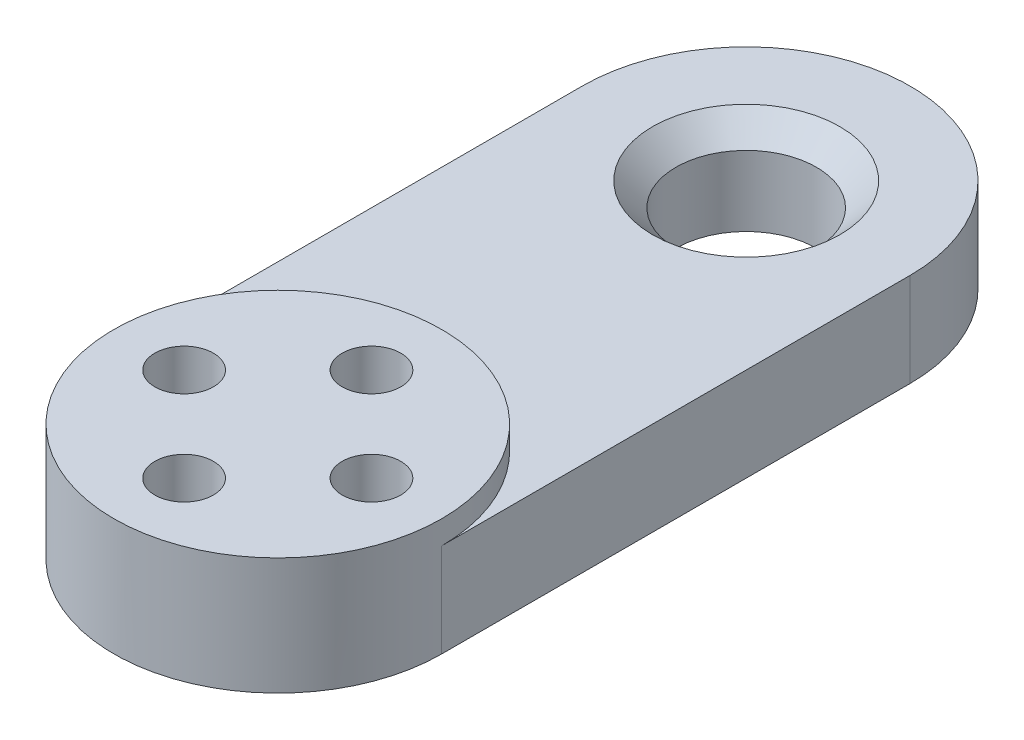
ISO-10303-21;
HEADER;
FILE_DESCRIPTION(('STEP AP214'),'2;1');
FILE_NAME('part.step','',(''),(''),'','','');
FILE_SCHEMA(('AUTOMOTIVE_DESIGN { 1 0 10303 214 1 1 1 1 }'));
ENDSEC;
DATA;
#1=APPLICATION_CONTEXT('core data for automotive mechanical design processes');
#2=APPLICATION_PROTOCOL_DEFINITION('international standard','automotive_design',2000,#1);
#3=PRODUCT_CONTEXT('',#1,'mechanical');
#4=PRODUCT('Part','Part','',(#3));
#5=PRODUCT_RELATED_PRODUCT_CATEGORY('part','',(#4));
#6=PRODUCT_DEFINITION_FORMATION('','',#4);
#7=PRODUCT_DEFINITION_CONTEXT('part definition',#1,'design');
#8=PRODUCT_DEFINITION('design','',#6,#7);
#9=PRODUCT_DEFINITION_SHAPE('','',#8);
#10=(LENGTH_UNIT() NAMED_UNIT(*) SI_UNIT(.MILLI.,.METRE.));
#11=(NAMED_UNIT(*) PLANE_ANGLE_UNIT() SI_UNIT($,.RADIAN.));
#12=(NAMED_UNIT(*) SI_UNIT($,.STERADIAN.) SOLID_ANGLE_UNIT());
#13=UNCERTAINTY_MEASURE_WITH_UNIT(LENGTH_MEASURE(1.E-05),#10,'distance_accuracy_value','');
#14=(GEOMETRIC_REPRESENTATION_CONTEXT(3) GLOBAL_UNCERTAINTY_ASSIGNED_CONTEXT((#13)) GLOBAL_UNIT_ASSIGNED_CONTEXT((#10,
#11,#12)) REPRESENTATION_CONTEXT('',''));
#15=CARTESIAN_POINT('',(0.,0.,0.));
#16=DIRECTION('',(0.,0.,1.));
#17=DIRECTION('',(1.,0.,0.));
#18=AXIS2_PLACEMENT_3D('',#15,#16,#17);
#19=CARTESIAN_POINT('',(0.,4.,0.));
#20=DIRECTION('',(0.,1.,0.));
#21=DIRECTION('',(0.,0.,1.));
#22=AXIS2_PLACEMENT_3D('',#19,#20,#21);
#23=PLANE('',#22);
#24=CARTESIAN_POINT('',(0.,4.,0.));
#25=DIRECTION('',(0.,1.,0.));
#26=DIRECTION('',(0.,0.,1.));
#27=AXIS2_PLACEMENT_3D('',#24,#25,#26);
#28=CIRCLE('',#27,7.);
#29=CARTESIAN_POINT('',(7.,4.,0.));
#30=VERTEX_POINT('',#29);
#31=CARTESIAN_POINT('',(-7.,4.,0.));
#32=VERTEX_POINT('',#31);
#33=EDGE_CURVE('E102',#30,#32,#28,.T.);
#34=ORIENTED_EDGE('',*,*,#33,.F.);
#35=DIRECTION('',(0.,0.,-1.));
#36=VECTOR('',#35,1.);
#37=CARTESIAN_POINT('',(7.,4.,-20.));
#38=LINE('',#37,#36);
#39=CARTESIAN_POINT('',(6.99999999999999,4.,-20.));
#40=VERTEX_POINT('',#39);
#41=EDGE_CURVE('E91',#30,#40,#38,.T.);
#42=ORIENTED_EDGE('',*,*,#41,.T.);
#43=CARTESIAN_POINT('',(0.,4.,-20.));
#44=DIRECTION('',(0.,1.,0.));
#45=DIRECTION('',(0.,0.,1.));
#46=AXIS2_PLACEMENT_3D('',#43,#44,#45);
#47=CIRCLE('',#46,7.);
#48=CARTESIAN_POINT('',(-7.,4.,-20.));
#49=VERTEX_POINT('',#48);
#50=EDGE_CURVE('E110',#40,#49,#47,.T.);
#51=ORIENTED_EDGE('',*,*,#50,.T.);
#52=DIRECTION('',(0.,0.,1.));
#53=VECTOR('',#52,1.);
#54=CARTESIAN_POINT('',(-7.,4.,0.));
#55=LINE('',#54,#53);
#56=EDGE_CURVE('E64',#49,#32,#55,.T.);
#57=ORIENTED_EDGE('',*,*,#56,.T.);
#58=EDGE_LOOP('',(#34,#42,#51,#57));
#59=FACE_BOUND('',#58,.T.);
#60=CARTESIAN_POINT('',(0.,4.,-20.));
#61=DIRECTION('',(0.,1.,0.));
#62=DIRECTION('',(0.,0.,1.));
#63=AXIS2_PLACEMENT_3D('',#60,#61,#62);
#64=CIRCLE('',#63,4.);
#65=CARTESIAN_POINT('',(0.,4.,-16.));
#66=VERTEX_POINT('',#65);
#67=EDGE_CURVE('E11',#66,#66,#64,.F.);
#68=ORIENTED_EDGE('',*,*,#67,.T.);
#69=EDGE_LOOP('',(#68));
#70=FACE_BOUND('',#69,.T.);
#71=ADVANCED_FACE('F46',(#59,#70),#23,.T.);
#72=CARTESIAN_POINT('',(0.,0.,0.));
#73=DIRECTION('',(0.,1.,0.));
#74=DIRECTION('',(0.,0.,1.));
#75=AXIS2_PLACEMENT_3D('',#72,#73,#74);
#76=PLANE('',#75);
#77=CARTESIAN_POINT('',(0.,0.,0.));
#78=DIRECTION('',(0.,1.,0.));
#79=DIRECTION('',(0.,0.,1.));
#80=AXIS2_PLACEMENT_3D('',#77,#78,#79);
#81=CIRCLE('',#80,7.);
#82=CARTESIAN_POINT('',(-7.,0.,0.));
#83=VERTEX_POINT('',#82);
#84=CARTESIAN_POINT('',(7.,0.,0.));
#85=VERTEX_POINT('',#84);
#86=EDGE_CURVE('E104',#83,#85,#81,.T.);
#87=ORIENTED_EDGE('',*,*,#86,.F.);
#88=DIRECTION('',(0.,0.,1.));
#89=VECTOR('',#88,1.);
#90=CARTESIAN_POINT('',(-7.,0.,0.));
#91=LINE('',#90,#89);
#92=CARTESIAN_POINT('',(-7.,0.,-20.));
#93=VERTEX_POINT('',#92);
#94=EDGE_CURVE('E87',#93,#83,#91,.T.);
#95=ORIENTED_EDGE('',*,*,#94,.F.);
#96=CARTESIAN_POINT('',(0.,0.,-20.));
#97=DIRECTION('',(0.,1.,0.));
#98=DIRECTION('',(0.,0.,1.));
#99=AXIS2_PLACEMENT_3D('',#96,#97,#98);
#100=CIRCLE('',#99,7.);
#101=CARTESIAN_POINT('',(6.99999999999999,0.,-20.));
#102=VERTEX_POINT('',#101);
#103=EDGE_CURVE('E82',#102,#93,#100,.T.);
#104=ORIENTED_EDGE('',*,*,#103,.F.);
#105=DIRECTION('',(0.,0.,-1.));
#106=VECTOR('',#105,1.);
#107=CARTESIAN_POINT('',(7.,0.,-20.));
#108=LINE('',#107,#106);
#109=EDGE_CURVE('E141',#85,#102,#108,.T.);
#110=ORIENTED_EDGE('',*,*,#109,.F.);
#111=EDGE_LOOP('',(#87,#95,#104,#110));
#112=FACE_BOUND('',#111,.T.);
#113=CARTESIAN_POINT('',(0.,0.,-4.));
#114=DIRECTION('',(0.,1.,0.));
#115=DIRECTION('',(0.,0.,1.));
#116=AXIS2_PLACEMENT_3D('',#113,#114,#115);
#117=CIRCLE('',#116,1.25);
#118=CARTESIAN_POINT('',(0.,0.,-2.75));
#119=VERTEX_POINT('',#118);
#120=EDGE_CURVE('E134',#119,#119,#117,.T.);
#121=ORIENTED_EDGE('',*,*,#120,.T.);
#122=EDGE_LOOP('',(#121));
#123=FACE_BOUND('',#122,.T.);
#124=CARTESIAN_POINT('',(4.,0.,0.));
#125=DIRECTION('',(0.,1.,0.));
#126=DIRECTION('',(0.,0.,1.));
#127=AXIS2_PLACEMENT_3D('',#124,#125,#126);
#128=CIRCLE('',#127,1.25);
#129=CARTESIAN_POINT('',(4.,0.,1.25));
#130=VERTEX_POINT('',#129);
#131=EDGE_CURVE('E131',#130,#130,#128,.T.);
#132=ORIENTED_EDGE('',*,*,#131,.T.);
#133=EDGE_LOOP('',(#132));
#134=FACE_BOUND('',#133,.T.);
#135=CARTESIAN_POINT('',(0.,0.,4.));
#136=DIRECTION('',(0.,1.,0.));
#137=DIRECTION('',(0.,0.,1.));
#138=AXIS2_PLACEMENT_3D('',#135,#136,#137);
#139=CIRCLE('',#138,1.25);
#140=CARTESIAN_POINT('',(0.,0.,5.25));
#141=VERTEX_POINT('',#140);
#142=EDGE_CURVE('E128',#141,#141,#139,.T.);
#143=ORIENTED_EDGE('',*,*,#142,.T.);
#144=EDGE_LOOP('',(#143));
#145=FACE_BOUND('',#144,.T.);
#146=CARTESIAN_POINT('',(-4.,0.,0.));
#147=DIRECTION('',(0.,1.,0.));
#148=DIRECTION('',(0.,0.,1.));
#149=AXIS2_PLACEMENT_3D('',#146,#147,#148);
#150=CIRCLE('',#149,1.25);
#151=CARTESIAN_POINT('',(-4.,0.,1.25));
#152=VERTEX_POINT('',#151);
#153=EDGE_CURVE('E125',#152,#152,#150,.T.);
#154=ORIENTED_EDGE('',*,*,#153,.T.);
#155=EDGE_LOOP('',(#154));
#156=FACE_BOUND('',#155,.T.);
#157=CARTESIAN_POINT('',(0.,0.,-20.));
#158=DIRECTION('',(0.,1.,0.));
#159=DIRECTION('',(0.,0.,1.));
#160=AXIS2_PLACEMENT_3D('',#157,#158,#159);
#161=CIRCLE('',#160,3.);
#162=CARTESIAN_POINT('',(0.,0.,-17.));
#163=VERTEX_POINT('',#162);
#164=EDGE_CURVE('E117',#163,#163,#161,.T.);
#165=ORIENTED_EDGE('',*,*,#164,.T.);
#166=EDGE_LOOP('',(#165));
#167=FACE_BOUND('',#166,.T.);
#168=ADVANCED_FACE('F167',(#112,#123,#134,#145,#156,#167),#76,.F.);
#169=CARTESIAN_POINT('',(0.,4.,0.));
#170=DIRECTION('',(0.,-1.,0.));
#171=DIRECTION('',(0.,0.,-1.));
#172=AXIS2_PLACEMENT_3D('',#169,#170,#171);
#173=CYLINDRICAL_SURFACE('',#172,7.);
#174=ORIENTED_EDGE('',*,*,#86,.T.);
#175=DIRECTION('',(0.,-1.,0.));
#176=VECTOR('',#175,1.);
#177=CARTESIAN_POINT('',(7.,4.,0.));
#178=LINE('',#177,#176);
#179=EDGE_CURVE('E99',#30,#85,#178,.T.);
#180=ORIENTED_EDGE('',*,*,#179,.F.);
#181=ORIENTED_EDGE('',*,*,#33,.T.);
#182=DIRECTION('',(0.,-1.,0.));
#183=VECTOR('',#182,1.);
#184=CARTESIAN_POINT('',(-7.,4.,0.));
#185=LINE('',#184,#183);
#186=EDGE_CURVE('E139',#32,#83,#185,.T.);
#187=ORIENTED_EDGE('',*,*,#186,.T.);
#188=EDGE_LOOP('',(#174,#180,#181,#187));
#189=FACE_BOUND('',#188,.T.);
#190=CARTESIAN_POINT('',(0.,5.,0.));
#191=DIRECTION('',(0.,1.,0.));
#192=DIRECTION('',(0.,0.,1.));
#193=AXIS2_PLACEMENT_3D('',#190,#191,#192);
#194=CIRCLE('',#193,7.);
#195=CARTESIAN_POINT('',(0.,5.,7.));
#196=VERTEX_POINT('',#195);
#197=EDGE_CURVE('E113',#196,#196,#194,.T.);
#198=ORIENTED_EDGE('',*,*,#197,.F.);
#199=EDGE_LOOP('',(#198));
#200=FACE_BOUND('',#199,.T.);
#201=ADVANCED_FACE('F100',(#189,#200),#173,.T.);
#202=CARTESIAN_POINT('',(7.,4.,-20.));
#203=DIRECTION('',(-1.,0.,0.));
#204=DIRECTION('',(0.,0.,1.));
#205=AXIS2_PLACEMENT_3D('',#202,#203,#204);
#206=PLANE('',#205);
#207=ORIENTED_EDGE('',*,*,#109,.T.);
#208=DIRECTION('',(0.,-1.,0.));
#209=VECTOR('',#208,1.);
#210=CARTESIAN_POINT('',(6.99999999999999,4.,-20.));
#211=LINE('',#210,#209);
#212=EDGE_CURVE('E106',#40,#102,#211,.T.);
#213=ORIENTED_EDGE('',*,*,#212,.F.);
#214=ORIENTED_EDGE('',*,*,#41,.F.);
#215=ORIENTED_EDGE('',*,*,#179,.T.);
#216=EDGE_LOOP('',(#207,#213,#214,#215));
#217=FACE_BOUND('',#216,.T.);
#218=ADVANCED_FACE('F108',(#217),#206,.F.);
#219=CARTESIAN_POINT('',(0.,4.,-20.));
#220=DIRECTION('',(0.,-1.,0.));
#221=DIRECTION('',(0.,0.,-1.));
#222=AXIS2_PLACEMENT_3D('',#219,#220,#221);
#223=CYLINDRICAL_SURFACE('',#222,7.);
#224=ORIENTED_EDGE('',*,*,#103,.T.);
#225=DIRECTION('',(0.,-1.,0.));
#226=VECTOR('',#225,1.);
#227=CARTESIAN_POINT('',(-7.,4.,-20.));
#228=LINE('',#227,#226);
#229=EDGE_CURVE('E146',#49,#93,#228,.T.);
#230=ORIENTED_EDGE('',*,*,#229,.F.);
#231=ORIENTED_EDGE('',*,*,#50,.F.);
#232=ORIENTED_EDGE('',*,*,#212,.T.);
#233=EDGE_LOOP('',(#224,#230,#231,#232));
#234=FACE_BOUND('',#233,.T.);
#235=ADVANCED_FACE('F181',(#234),#223,.T.);
#236=CARTESIAN_POINT('',(-7.,4.,0.));
#237=DIRECTION('',(1.,0.,0.));
#238=DIRECTION('',(0.,0.,-1.));
#239=AXIS2_PLACEMENT_3D('',#236,#237,#238);
#240=PLANE('',#239);
#241=ORIENTED_EDGE('',*,*,#94,.T.);
#242=ORIENTED_EDGE('',*,*,#186,.F.);
#243=ORIENTED_EDGE('',*,*,#56,.F.);
#244=ORIENTED_EDGE('',*,*,#229,.T.);
#245=EDGE_LOOP('',(#241,#242,#243,#244));
#246=FACE_BOUND('',#245,.T.);
#247=ADVANCED_FACE('F178',(#246),#240,.F.);
#248=CARTESIAN_POINT('',(0.,4.,-4.));
#249=DIRECTION('',(0.,-1.,0.));
#250=DIRECTION('',(0.,0.,-1.));
#251=AXIS2_PLACEMENT_3D('',#248,#249,#250);
#252=CYLINDRICAL_SURFACE('',#251,1.25);
#253=ORIENTED_EDGE('',*,*,#120,.F.);
#254=EDGE_LOOP('',(#253));
#255=FACE_BOUND('',#254,.T.);
#256=CARTESIAN_POINT('',(0.,5.,-4.));
#257=DIRECTION('',(0.,1.,0.));
#258=DIRECTION('',(0.,0.,1.));
#259=AXIS2_PLACEMENT_3D('',#256,#257,#258);
#260=CIRCLE('',#259,1.25);
#261=CARTESIAN_POINT('',(0.,5.,-2.75));
#262=VERTEX_POINT('',#261);
#263=EDGE_CURVE('E120',#262,#262,#260,.T.);
#264=ORIENTED_EDGE('',*,*,#263,.T.);
#265=EDGE_LOOP('',(#264));
#266=FACE_BOUND('',#265,.T.);
#267=ADVANCED_FACE('F175',(#255,#266),#252,.F.);
#268=CARTESIAN_POINT('',(4.,4.,0.));
#269=DIRECTION('',(0.,-1.,0.));
#270=DIRECTION('',(0.,0.,-1.));
#271=AXIS2_PLACEMENT_3D('',#268,#269,#270);
#272=CYLINDRICAL_SURFACE('',#271,1.25);
#273=ORIENTED_EDGE('',*,*,#131,.F.);
#274=EDGE_LOOP('',(#273));
#275=FACE_BOUND('',#274,.T.);
#276=CARTESIAN_POINT('',(4.,5.,0.));
#277=DIRECTION('',(0.,1.,0.));
#278=DIRECTION('',(0.,0.,1.));
#279=AXIS2_PLACEMENT_3D('',#276,#277,#278);
#280=CIRCLE('',#279,1.25);
#281=CARTESIAN_POINT('',(4.,5.,1.25));
#282=VERTEX_POINT('',#281);
#283=EDGE_CURVE('E114',#282,#282,#280,.T.);
#284=ORIENTED_EDGE('',*,*,#283,.T.);
#285=EDGE_LOOP('',(#284));
#286=FACE_BOUND('',#285,.T.);
#287=ADVANCED_FACE('F209',(#275,#286),#272,.F.);
#288=CARTESIAN_POINT('',(0.,4.,4.));
#289=DIRECTION('',(0.,-1.,0.));
#290=DIRECTION('',(0.,0.,-1.));
#291=AXIS2_PLACEMENT_3D('',#288,#289,#290);
#292=CYLINDRICAL_SURFACE('',#291,1.25);
#293=ORIENTED_EDGE('',*,*,#142,.F.);
#294=EDGE_LOOP('',(#293));
#295=FACE_BOUND('',#294,.T.);
#296=CARTESIAN_POINT('',(0.,5.,4.));
#297=DIRECTION('',(0.,1.,0.));
#298=DIRECTION('',(0.,0.,1.));
#299=AXIS2_PLACEMENT_3D('',#296,#297,#298);
#300=CIRCLE('',#299,1.25);
#301=CARTESIAN_POINT('',(0.,5.,5.25));
#302=VERTEX_POINT('',#301);
#303=EDGE_CURVE('E318',#302,#302,#300,.T.);
#304=ORIENTED_EDGE('',*,*,#303,.T.);
#305=EDGE_LOOP('',(#304));
#306=FACE_BOUND('',#305,.T.);
#307=ADVANCED_FACE('F216',(#295,#306),#292,.F.);
#308=CARTESIAN_POINT('',(-4.,4.,0.));
#309=DIRECTION('',(0.,-1.,0.));
#310=DIRECTION('',(0.,0.,-1.));
#311=AXIS2_PLACEMENT_3D('',#308,#309,#310);
#312=CYLINDRICAL_SURFACE('',#311,1.25);
#313=ORIENTED_EDGE('',*,*,#153,.F.);
#314=EDGE_LOOP('',(#313));
#315=FACE_BOUND('',#314,.T.);
#316=CARTESIAN_POINT('',(-4.,5.,0.));
#317=DIRECTION('',(0.,1.,0.));
#318=DIRECTION('',(0.,0.,1.));
#319=AXIS2_PLACEMENT_3D('',#316,#317,#318);
#320=CIRCLE('',#319,1.25);
#321=CARTESIAN_POINT('',(-4.,5.,1.25));
#322=VERTEX_POINT('',#321);
#323=EDGE_CURVE('E317',#322,#322,#320,.T.);
#324=ORIENTED_EDGE('',*,*,#323,.T.);
#325=EDGE_LOOP('',(#324));
#326=FACE_BOUND('',#325,.T.);
#327=ADVANCED_FACE('F163',(#315,#326),#312,.F.);
#328=CARTESIAN_POINT('',(0.,4.,-20.));
#329=DIRECTION('',(0.,-1.,0.));
#330=DIRECTION('',(0.,0.,-1.));
#331=AXIS2_PLACEMENT_3D('',#328,#329,#330);
#332=CYLINDRICAL_SURFACE('',#331,3.);
#333=CARTESIAN_POINT('',(0.,3.,-20.));
#334=DIRECTION('',(0.,1.,0.));
#335=DIRECTION('',(0.,0.,1.));
#336=AXIS2_PLACEMENT_3D('',#333,#334,#335);
#337=CIRCLE('',#336,3.);
#338=CARTESIAN_POINT('',(0.,3.,-17.));
#339=VERTEX_POINT('',#338);
#340=EDGE_CURVE('E56',#339,#339,#337,.T.);
#341=ORIENTED_EDGE('',*,*,#340,.T.);
#342=EDGE_LOOP('',(#341));
#343=FACE_BOUND('',#342,.T.);
#344=ORIENTED_EDGE('',*,*,#164,.F.);
#345=EDGE_LOOP('',(#344));
#346=FACE_BOUND('',#345,.T.);
#347=ADVANCED_FACE('F151',(#343,#346),#332,.F.);
#348=CARTESIAN_POINT('',(0.,3.,-20.));
#349=DIRECTION('',(0.,1.,0.));
#350=DIRECTION('',(0.,0.,1.));
#351=AXIS2_PLACEMENT_3D('',#348,#349,#350);
#352=CONICAL_SURFACE('',#351,3.,0.785398163397452);
#353=ORIENTED_EDGE('',*,*,#67,.F.);
#354=EDGE_LOOP('',(#353));
#355=FACE_BOUND('',#354,.T.);
#356=ORIENTED_EDGE('',*,*,#340,.F.);
#357=EDGE_LOOP('',(#356));
#358=FACE_BOUND('',#357,.T.);
#359=ADVANCED_FACE('F49',(#355,#358),#352,.F.);
#360=CARTESIAN_POINT('',(0.,5.,0.));
#361=DIRECTION('',(0.,1.,0.));
#362=DIRECTION('',(0.,0.,1.));
#363=AXIS2_PLACEMENT_3D('',#360,#361,#362);
#364=PLANE('',#363);
#365=ORIENTED_EDGE('',*,*,#323,.F.);
#366=EDGE_LOOP('',(#365));
#367=FACE_BOUND('',#366,.T.);
#368=ORIENTED_EDGE('',*,*,#283,.F.);
#369=EDGE_LOOP('',(#368));
#370=FACE_BOUND('',#369,.T.);
#371=ORIENTED_EDGE('',*,*,#197,.T.);
#372=EDGE_LOOP('',(#371));
#373=FACE_BOUND('',#372,.T.);
#374=ORIENTED_EDGE('',*,*,#263,.F.);
#375=EDGE_LOOP('',(#374));
#376=FACE_BOUND('',#375,.T.);
#377=ORIENTED_EDGE('',*,*,#303,.F.);
#378=EDGE_LOOP('',(#377));
#379=FACE_BOUND('',#378,.T.);
#380=ADVANCED_FACE('F155',(#367,#370,#373,#376,#379),#364,.T.);
#381=CLOSED_SHELL('',(#71,#168,#201,#218,#235,#247,#267,#287,#307,#327,#347,#359,#380));
#382=MANIFOLD_SOLID_BREP('B2',#381);
#383=ADVANCED_BREP_SHAPE_REPRESENTATION('',(#18,#382),#14);
#384=SHAPE_DEFINITION_REPRESENTATION(#9,#383);
ENDSEC;
END-ISO-10303-21;
